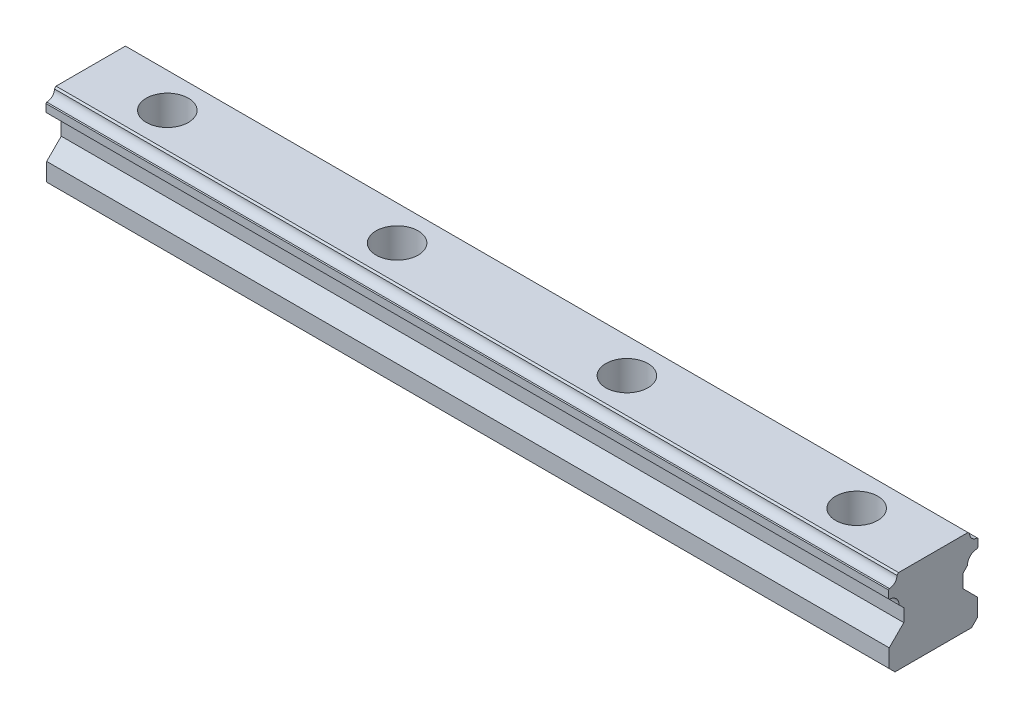
ISO-10303-21;
HEADER;
FILE_DESCRIPTION(('STEP AP214'),'2;1');
FILE_NAME('part.step','',(''),(''),'','','');
FILE_SCHEMA(('AUTOMOTIVE_DESIGN { 1 0 10303 214 1 1 1 1 }'));
ENDSEC;
DATA;
#1=APPLICATION_CONTEXT('core data for automotive mechanical design processes');
#2=APPLICATION_PROTOCOL_DEFINITION('international standard','automotive_design',2000,#1);
#3=PRODUCT_CONTEXT('',#1,'mechanical');
#4=PRODUCT('Part','Part','',(#3));
#5=PRODUCT_RELATED_PRODUCT_CATEGORY('part','',(#4));
#6=PRODUCT_DEFINITION_FORMATION('','',#4);
#7=PRODUCT_DEFINITION_CONTEXT('part definition',#1,'design');
#8=PRODUCT_DEFINITION('design','',#6,#7);
#9=PRODUCT_DEFINITION_SHAPE('','',#8);
#10=(LENGTH_UNIT() NAMED_UNIT(*) SI_UNIT(.MILLI.,.METRE.));
#11=(NAMED_UNIT(*) PLANE_ANGLE_UNIT() SI_UNIT($,.RADIAN.));
#12=(NAMED_UNIT(*) SI_UNIT($,.STERADIAN.) SOLID_ANGLE_UNIT());
#13=UNCERTAINTY_MEASURE_WITH_UNIT(LENGTH_MEASURE(1.E-05),#10,'distance_accuracy_value','');
#14=(GEOMETRIC_REPRESENTATION_CONTEXT(3) GLOBAL_UNCERTAINTY_ASSIGNED_CONTEXT((#13)) GLOBAL_UNIT_ASSIGNED_CONTEXT((#10,
#11,#12)) REPRESENTATION_CONTEXT('',''));
#15=CARTESIAN_POINT('',(0.,0.,0.));
#16=DIRECTION('',(0.,0.,1.));
#17=DIRECTION('',(1.,0.,0.));
#18=AXIS2_PLACEMENT_3D('',#15,#16,#17);
#19=CARTESIAN_POINT('',(220.,21.58,-11.47));
#20=DIRECTION('',(-1.,0.,0.));
#21=DIRECTION('',(0.,0.,1.));
#22=AXIS2_PLACEMENT_3D('',#19,#20,#21);
#23=CYLINDRICAL_SURFACE('',#22,1.99);
#24=CARTESIAN_POINT('',(0.,21.58,-11.47));
#25=DIRECTION('',(-1.,0.,0.));
#26=DIRECTION('',(0.,0.,-1.));
#27=AXIS2_PLACEMENT_3D('',#24,#25,#26);
#28=CIRCLE('',#27,1.99);
#29=CARTESIAN_POINT('',(0.,19.59,-11.47));
#30=VERTEX_POINT('',#29);
#31=CARTESIAN_POINT('',(0.,21.58,-9.47999999999999));
#32=VERTEX_POINT('',#31);
#33=EDGE_CURVE('E225',#30,#32,#28,.T.);
#34=ORIENTED_EDGE('',*,*,#33,.T.);
#35=DIRECTION('',(-1.,0.,0.));
#36=VECTOR('',#35,1.);
#37=CARTESIAN_POINT('',(220.,21.58,-9.47999999999999));
#38=LINE('',#37,#36);
#39=CARTESIAN_POINT('',(220.,21.58,-9.47999999999999));
#40=VERTEX_POINT('',#39);
#41=EDGE_CURVE('E11',#40,#32,#38,.T.);
#42=ORIENTED_EDGE('',*,*,#41,.F.);
#43=CARTESIAN_POINT('',(220.,21.58,-11.47));
#44=DIRECTION('',(-1.,0.,0.));
#45=DIRECTION('',(0.,0.,-1.));
#46=AXIS2_PLACEMENT_3D('',#43,#44,#45);
#47=CIRCLE('',#46,1.99);
#48=CARTESIAN_POINT('',(220.,19.59,-11.47));
#49=VERTEX_POINT('',#48);
#50=EDGE_CURVE('E272',#49,#40,#47,.T.);
#51=ORIENTED_EDGE('',*,*,#50,.F.);
#52=DIRECTION('',(-1.,0.,0.));
#53=VECTOR('',#52,1.);
#54=CARTESIAN_POINT('',(220.,19.59,-11.47));
#55=LINE('',#54,#53);
#56=EDGE_CURVE('E221',#49,#30,#55,.T.);
#57=ORIENTED_EDGE('',*,*,#56,.T.);
#58=EDGE_LOOP('',(#34,#42,#51,#57));
#59=FACE_BOUND('',#58,.T.);
#60=ADVANCED_FACE('F33',(#59),#23,.F.);
#61=CARTESIAN_POINT('',(220.,21.58,-9.47999999999999));
#62=DIRECTION('',(0.,-0.707106781186543,0.707106781186552));
#63=DIRECTION('',(0.,-0.707106781186552,-0.707106781186543));
#64=AXIS2_PLACEMENT_3D('',#61,#62,#63);
#65=PLANE('',#64);
#66=DIRECTION('',(0.,0.707106781186552,0.707106781186543));
#67=VECTOR('',#66,1.);
#68=CARTESIAN_POINT('',(0.,21.58,-9.47999999999999));
#69=LINE('',#68,#67);
#70=CARTESIAN_POINT('',(0.,22.,-9.05999999999999));
#71=VERTEX_POINT('',#70);
#72=EDGE_CURVE('E228',#32,#71,#69,.T.);
#73=ORIENTED_EDGE('',*,*,#72,.T.);
#74=DIRECTION('',(-1.,0.,0.));
#75=VECTOR('',#74,1.);
#76=CARTESIAN_POINT('',(220.,22.,-9.05999999999999));
#77=LINE('',#76,#75);
#78=CARTESIAN_POINT('',(220.,22.,-9.05999999999999));
#79=VERTEX_POINT('',#78);
#80=EDGE_CURVE('E41',#79,#71,#77,.T.);
#81=ORIENTED_EDGE('',*,*,#80,.F.);
#82=DIRECTION('',(0.,0.707106781186552,0.707106781186543));
#83=VECTOR('',#82,1.);
#84=CARTESIAN_POINT('',(220.,21.58,-9.47999999999999));
#85=LINE('',#84,#83);
#86=EDGE_CURVE('E140',#40,#79,#85,.T.);
#87=ORIENTED_EDGE('',*,*,#86,.F.);
#88=ORIENTED_EDGE('',*,*,#41,.T.);
#89=EDGE_LOOP('',(#73,#81,#87,#88));
#90=FACE_BOUND('',#89,.T.);
#91=ADVANCED_FACE('F410',(#90),#65,.F.);
#92=CARTESIAN_POINT('',(220.,22.,-9.05999999999999));
#93=DIRECTION('',(0.,-1.,0.));
#94=DIRECTION('',(0.,0.,-1.));
#95=AXIS2_PLACEMENT_3D('',#92,#93,#94);
#96=PLANE('',#95);
#97=CARTESIAN_POINT('',(200.,22.,0.));
#98=DIRECTION('',(0.,1.,0.));
#99=DIRECTION('',(0.,0.,1.));
#100=AXIS2_PLACEMENT_3D('',#97,#98,#99);
#101=CIRCLE('',#100,5.50000000000001);
#102=CARTESIAN_POINT('',(200.,22.,5.50000000000001));
#103=VERTEX_POINT('',#102);
#104=EDGE_CURVE('E656',#103,#103,#101,.T.);
#105=ORIENTED_EDGE('',*,*,#104,.F.);
#106=EDGE_LOOP('',(#105));
#107=FACE_BOUND('',#106,.T.);
#108=CARTESIAN_POINT('',(140.,22.,0.));
#109=DIRECTION('',(0.,1.,0.));
#110=DIRECTION('',(0.,0.,1.));
#111=AXIS2_PLACEMENT_3D('',#108,#109,#110);
#112=CIRCLE('',#111,5.50000000000001);
#113=CARTESIAN_POINT('',(140.,22.,5.50000000000001));
#114=VERTEX_POINT('',#113);
#115=EDGE_CURVE('E666',#114,#114,#112,.T.);
#116=ORIENTED_EDGE('',*,*,#115,.F.);
#117=EDGE_LOOP('',(#116));
#118=FACE_BOUND('',#117,.T.);
#119=CARTESIAN_POINT('',(80.,22.,0.));
#120=DIRECTION('',(0.,1.,0.));
#121=DIRECTION('',(0.,0.,1.));
#122=AXIS2_PLACEMENT_3D('',#119,#120,#121);
#123=CIRCLE('',#122,5.50000000000001);
#124=CARTESIAN_POINT('',(80.,22.,5.50000000000001));
#125=VERTEX_POINT('',#124);
#126=EDGE_CURVE('E678',#125,#125,#123,.T.);
#127=ORIENTED_EDGE('',*,*,#126,.F.);
#128=EDGE_LOOP('',(#127));
#129=FACE_BOUND('',#128,.T.);
#130=CARTESIAN_POINT('',(20.,22.,0.));
#131=DIRECTION('',(0.,1.,0.));
#132=DIRECTION('',(0.,0.,1.));
#133=AXIS2_PLACEMENT_3D('',#130,#131,#132);
#134=CIRCLE('',#133,5.5);
#135=CARTESIAN_POINT('',(20.,22.,5.5));
#136=VERTEX_POINT('',#135);
#137=EDGE_CURVE('E690',#136,#136,#134,.T.);
#138=ORIENTED_EDGE('',*,*,#137,.F.);
#139=EDGE_LOOP('',(#138));
#140=FACE_BOUND('',#139,.T.);
#141=DIRECTION('',(0.,0.,1.));
#142=VECTOR('',#141,1.);
#143=CARTESIAN_POINT('',(0.,22.,-9.05999999999999));
#144=LINE('',#143,#142);
#145=CARTESIAN_POINT('',(0.,22.,9.05999999999999));
#146=VERTEX_POINT('',#145);
#147=EDGE_CURVE('E231',#71,#146,#144,.T.);
#148=ORIENTED_EDGE('',*,*,#147,.T.);
#149=DIRECTION('',(-1.,0.,0.));
#150=VECTOR('',#149,1.);
#151=CARTESIAN_POINT('',(220.,22.,9.05999999999999));
#152=LINE('',#151,#150);
#153=CARTESIAN_POINT('',(220.,22.,9.05999999999999));
#154=VERTEX_POINT('',#153);
#155=EDGE_CURVE('E327',#154,#146,#152,.T.);
#156=ORIENTED_EDGE('',*,*,#155,.F.);
#157=DIRECTION('',(0.,0.,1.));
#158=VECTOR('',#157,1.);
#159=CARTESIAN_POINT('',(220.,22.,-9.05999999999999));
#160=LINE('',#159,#158);
#161=EDGE_CURVE('E335',#79,#154,#160,.T.);
#162=ORIENTED_EDGE('',*,*,#161,.F.);
#163=ORIENTED_EDGE('',*,*,#80,.T.);
#164=EDGE_LOOP('',(#148,#156,#162,#163));
#165=FACE_BOUND('',#164,.T.);
#166=ADVANCED_FACE('F333',(#107,#118,#129,#140,#165),#96,.F.);
#167=CARTESIAN_POINT('',(220.,21.58,9.47999999999999));
#168=DIRECTION('',(0.,-0.707106781186543,-0.707106781186552));
#169=DIRECTION('',(0.,0.707106781186552,-0.707106781186543));
#170=AXIS2_PLACEMENT_3D('',#167,#168,#169);
#171=PLANE('',#170);
#172=DIRECTION('',(0.,-0.707106781186552,0.707106781186543));
#173=VECTOR('',#172,1.);
#174=CARTESIAN_POINT('',(0.,21.58,9.47999999999999));
#175=LINE('',#174,#173);
#176=CARTESIAN_POINT('',(0.,21.58,9.47999999999999));
#177=VERTEX_POINT('',#176);
#178=EDGE_CURVE('E233',#146,#177,#175,.T.);
#179=ORIENTED_EDGE('',*,*,#178,.T.);
#180=DIRECTION('',(-1.,0.,0.));
#181=VECTOR('',#180,1.);
#182=CARTESIAN_POINT('',(220.,21.58,9.47999999999999));
#183=LINE('',#182,#181);
#184=CARTESIAN_POINT('',(220.,21.58,9.47999999999999));
#185=VERTEX_POINT('',#184);
#186=EDGE_CURVE('E324',#185,#177,#183,.T.);
#187=ORIENTED_EDGE('',*,*,#186,.F.);
#188=DIRECTION('',(0.,-0.707106781186552,0.707106781186543));
#189=VECTOR('',#188,1.);
#190=CARTESIAN_POINT('',(220.,21.58,9.47999999999999));
#191=LINE('',#190,#189);
#192=EDGE_CURVE('E353',#154,#185,#191,.T.);
#193=ORIENTED_EDGE('',*,*,#192,.F.);
#194=ORIENTED_EDGE('',*,*,#155,.T.);
#195=EDGE_LOOP('',(#179,#187,#193,#194));
#196=FACE_BOUND('',#195,.T.);
#197=ADVANCED_FACE('F344',(#196),#171,.F.);
#198=CARTESIAN_POINT('',(220.,21.58,11.47));
#199=DIRECTION('',(-1.,0.,0.));
#200=DIRECTION('',(0.,0.,1.));
#201=AXIS2_PLACEMENT_3D('',#198,#199,#200);
#202=CYLINDRICAL_SURFACE('',#201,1.99);
#203=CARTESIAN_POINT('',(0.,21.58,11.47));
#204=DIRECTION('',(-1.,0.,0.));
#205=DIRECTION('',(0.,0.,1.));
#206=AXIS2_PLACEMENT_3D('',#203,#204,#205);
#207=CIRCLE('',#206,1.99);
#208=CARTESIAN_POINT('',(0.,19.59,11.47));
#209=VERTEX_POINT('',#208);
#210=EDGE_CURVE('E235',#177,#209,#207,.T.);
#211=ORIENTED_EDGE('',*,*,#210,.T.);
#212=DIRECTION('',(-1.,0.,0.));
#213=VECTOR('',#212,1.);
#214=CARTESIAN_POINT('',(220.,19.59,11.47));
#215=LINE('',#214,#213);
#216=CARTESIAN_POINT('',(220.,19.59,11.47));
#217=VERTEX_POINT('',#216);
#218=EDGE_CURVE('E321',#217,#209,#215,.T.);
#219=ORIENTED_EDGE('',*,*,#218,.F.);
#220=CARTESIAN_POINT('',(220.,21.58,11.47));
#221=DIRECTION('',(-1.,0.,0.));
#222=DIRECTION('',(0.,0.,1.));
#223=AXIS2_PLACEMENT_3D('',#220,#221,#222);
#224=CIRCLE('',#223,1.99);
#225=EDGE_CURVE('E350',#185,#217,#224,.T.);
#226=ORIENTED_EDGE('',*,*,#225,.F.);
#227=ORIENTED_EDGE('',*,*,#186,.T.);
#228=EDGE_LOOP('',(#211,#219,#226,#227));
#229=FACE_BOUND('',#228,.T.);
#230=ADVANCED_FACE('F348',(#229),#202,.F.);
#231=CARTESIAN_POINT('',(220.,19.38,11.68));
#232=DIRECTION('',(0.,-0.707106781186542,-0.707106781186553));
#233=DIRECTION('',(0.,0.707106781186553,-0.707106781186542));
#234=AXIS2_PLACEMENT_3D('',#231,#232,#233);
#235=PLANE('',#234);
#236=DIRECTION('',(0.,-0.707106781186553,0.707106781186542));
#237=VECTOR('',#236,1.);
#238=CARTESIAN_POINT('',(0.,19.38,11.68));
#239=LINE('',#238,#237);
#240=CARTESIAN_POINT('',(0.,19.38,11.68));
#241=VERTEX_POINT('',#240);
#242=EDGE_CURVE('E237',#209,#241,#239,.T.);
#243=ORIENTED_EDGE('',*,*,#242,.T.);
#244=DIRECTION('',(-1.,0.,0.));
#245=VECTOR('',#244,1.);
#246=CARTESIAN_POINT('',(220.,19.38,11.68));
#247=LINE('',#246,#245);
#248=CARTESIAN_POINT('',(220.,19.38,11.68));
#249=VERTEX_POINT('',#248);
#250=EDGE_CURVE('E318',#249,#241,#247,.T.);
#251=ORIENTED_EDGE('',*,*,#250,.F.);
#252=DIRECTION('',(0.,-0.707106781186553,0.707106781186542));
#253=VECTOR('',#252,1.);
#254=CARTESIAN_POINT('',(220.,19.38,11.68));
#255=LINE('',#254,#253);
#256=EDGE_CURVE('E352',#217,#249,#255,.T.);
#257=ORIENTED_EDGE('',*,*,#256,.F.);
#258=ORIENTED_EDGE('',*,*,#218,.T.);
#259=EDGE_LOOP('',(#243,#251,#257,#258));
#260=FACE_BOUND('',#259,.T.);
#261=ADVANCED_FACE('F424',(#260),#235,.F.);
#262=CARTESIAN_POINT('',(220.,17.36,11.68));
#263=DIRECTION('',(0.,0.,-1.));
#264=DIRECTION('',(-1.,0.,0.));
#265=AXIS2_PLACEMENT_3D('',#262,#263,#264);
#266=PLANE('',#265);
#267=DIRECTION('',(0.,-1.,0.));
#268=VECTOR('',#267,1.);
#269=CARTESIAN_POINT('',(0.,17.36,11.68));
#270=LINE('',#269,#268);
#271=CARTESIAN_POINT('',(0.,17.36,11.68));
#272=VERTEX_POINT('',#271);
#273=EDGE_CURVE('E239',#241,#272,#270,.T.);
#274=ORIENTED_EDGE('',*,*,#273,.T.);
#275=DIRECTION('',(-1.,0.,0.));
#276=VECTOR('',#275,1.);
#277=CARTESIAN_POINT('',(220.,17.36,11.68));
#278=LINE('',#277,#276);
#279=CARTESIAN_POINT('',(220.,17.36,11.68));
#280=VERTEX_POINT('',#279);
#281=EDGE_CURVE('E315',#280,#272,#278,.T.);
#282=ORIENTED_EDGE('',*,*,#281,.F.);
#283=DIRECTION('',(0.,-1.,0.));
#284=VECTOR('',#283,1.);
#285=CARTESIAN_POINT('',(220.,17.36,11.68));
#286=LINE('',#285,#284);
#287=EDGE_CURVE('E355',#249,#280,#286,.T.);
#288=ORIENTED_EDGE('',*,*,#287,.F.);
#289=ORIENTED_EDGE('',*,*,#250,.T.);
#290=EDGE_LOOP('',(#274,#282,#288,#289));
#291=FACE_BOUND('',#290,.T.);
#292=ADVANCED_FACE('F427',(#291),#266,.F.);
#293=CARTESIAN_POINT('',(220.,17.14,11.46));
#294=DIRECTION('',(0.,0.707106781186548,-0.707106781186548));
#295=DIRECTION('',(0.,0.707106781186548,0.707106781186548));
#296=AXIS2_PLACEMENT_3D('',#293,#294,#295);
#297=PLANE('',#296);
#298=DIRECTION('',(0.,-0.707106781186548,-0.707106781186548));
#299=VECTOR('',#298,1.);
#300=CARTESIAN_POINT('',(0.,17.14,11.46));
#301=LINE('',#300,#299);
#302=CARTESIAN_POINT('',(0.,17.14,11.46));
#303=VERTEX_POINT('',#302);
#304=EDGE_CURVE('E241',#272,#303,#301,.T.);
#305=ORIENTED_EDGE('',*,*,#304,.T.);
#306=DIRECTION('',(-1.,0.,0.));
#307=VECTOR('',#306,1.);
#308=CARTESIAN_POINT('',(220.,17.14,11.46));
#309=LINE('',#308,#307);
#310=CARTESIAN_POINT('',(220.,17.14,11.46));
#311=VERTEX_POINT('',#310);
#312=EDGE_CURVE('E312',#311,#303,#309,.T.);
#313=ORIENTED_EDGE('',*,*,#312,.F.);
#314=DIRECTION('',(0.,-0.707106781186548,-0.707106781186548));
#315=VECTOR('',#314,1.);
#316=CARTESIAN_POINT('',(220.,17.14,11.46));
#317=LINE('',#316,#315);
#318=EDGE_CURVE('E361',#280,#311,#317,.T.);
#319=ORIENTED_EDGE('',*,*,#318,.F.);
#320=ORIENTED_EDGE('',*,*,#281,.T.);
#321=EDGE_LOOP('',(#305,#313,#319,#320));
#322=FACE_BOUND('',#321,.T.);
#323=ADVANCED_FACE('F431',(#322),#297,.F.);
#324=CARTESIAN_POINT('',(220.,14.61,11.46));
#325=DIRECTION('',(-1.,0.,0.));
#326=DIRECTION('',(0.,0.,1.));
#327=AXIS2_PLACEMENT_3D('',#324,#325,#326);
#328=CYLINDRICAL_SURFACE('',#327,2.53);
#329=CARTESIAN_POINT('',(0.,14.61,11.46));
#330=DIRECTION('',(-1.,0.,0.));
#331=DIRECTION('',(0.,0.,1.));
#332=AXIS2_PLACEMENT_3D('',#329,#330,#331);
#333=CIRCLE('',#332,2.53);
#334=CARTESIAN_POINT('',(0.,14.61,8.92999999999999));
#335=VERTEX_POINT('',#334);
#336=EDGE_CURVE('E243',#303,#335,#333,.T.);
#337=ORIENTED_EDGE('',*,*,#336,.T.);
#338=DIRECTION('',(-1.,0.,0.));
#339=VECTOR('',#338,1.);
#340=CARTESIAN_POINT('',(220.,14.61,8.92999999999999));
#341=LINE('',#340,#339);
#342=CARTESIAN_POINT('',(220.,14.61,8.92999999999999));
#343=VERTEX_POINT('',#342);
#344=EDGE_CURVE('E309',#343,#335,#341,.T.);
#345=ORIENTED_EDGE('',*,*,#344,.F.);
#346=CARTESIAN_POINT('',(220.,14.61,11.46));
#347=DIRECTION('',(-1.,0.,0.));
#348=DIRECTION('',(0.,0.,1.));
#349=AXIS2_PLACEMENT_3D('',#346,#347,#348);
#350=CIRCLE('',#349,2.53);
#351=EDGE_CURVE('E363',#311,#343,#350,.T.);
#352=ORIENTED_EDGE('',*,*,#351,.F.);
#353=ORIENTED_EDGE('',*,*,#312,.T.);
#354=EDGE_LOOP('',(#337,#345,#352,#353));
#355=FACE_BOUND('',#354,.T.);
#356=ADVANCED_FACE('F435',(#355),#328,.F.);
#357=CARTESIAN_POINT('',(220.,13.38,7.69999999999999));
#358=DIRECTION('',(0.,0.707106781186549,-0.707106781186547));
#359=DIRECTION('',(0.,0.707106781186547,0.707106781186549));
#360=AXIS2_PLACEMENT_3D('',#357,#358,#359);
#361=PLANE('',#360);
#362=DIRECTION('',(0.,-0.707106781186547,-0.707106781186549));
#363=VECTOR('',#362,1.);
#364=CARTESIAN_POINT('',(0.,13.38,7.69999999999999));
#365=LINE('',#364,#363);
#366=CARTESIAN_POINT('',(0.,13.38,7.69999999999999));
#367=VERTEX_POINT('',#366);
#368=EDGE_CURVE('E245',#335,#367,#365,.T.);
#369=ORIENTED_EDGE('',*,*,#368,.T.);
#370=DIRECTION('',(-1.,0.,0.));
#371=VECTOR('',#370,1.);
#372=CARTESIAN_POINT('',(220.,13.38,7.69999999999999));
#373=LINE('',#372,#371);
#374=CARTESIAN_POINT('',(220.,13.38,7.69999999999999));
#375=VERTEX_POINT('',#374);
#376=EDGE_CURVE('E306',#375,#367,#373,.T.);
#377=ORIENTED_EDGE('',*,*,#376,.F.);
#378=DIRECTION('',(0.,-0.707106781186547,-0.707106781186549));
#379=VECTOR('',#378,1.);
#380=CARTESIAN_POINT('',(220.,13.38,7.69999999999999));
#381=LINE('',#380,#379);
#382=EDGE_CURVE('E365',#343,#375,#381,.T.);
#383=ORIENTED_EDGE('',*,*,#382,.F.);
#384=ORIENTED_EDGE('',*,*,#344,.T.);
#385=EDGE_LOOP('',(#369,#377,#383,#384));
#386=FACE_BOUND('',#385,.T.);
#387=ADVANCED_FACE('F439',(#386),#361,.F.);
#388=CARTESIAN_POINT('',(220.,10.,7.69999999999999));
#389=DIRECTION('',(0.,0.,-1.));
#390=DIRECTION('',(-1.,0.,0.));
#391=AXIS2_PLACEMENT_3D('',#388,#389,#390);
#392=PLANE('',#391);
#393=DIRECTION('',(0.,-1.,0.));
#394=VECTOR('',#393,1.);
#395=CARTESIAN_POINT('',(0.,10.,7.69999999999999));
#396=LINE('',#395,#394);
#397=CARTESIAN_POINT('',(0.,10.,7.69999999999999));
#398=VERTEX_POINT('',#397);
#399=EDGE_CURVE('E247',#367,#398,#396,.T.);
#400=ORIENTED_EDGE('',*,*,#399,.T.);
#401=DIRECTION('',(-1.,0.,0.));
#402=VECTOR('',#401,1.);
#403=CARTESIAN_POINT('',(220.,10.,7.69999999999999));
#404=LINE('',#403,#402);
#405=CARTESIAN_POINT('',(220.,10.,7.69999999999999));
#406=VERTEX_POINT('',#405);
#407=EDGE_CURVE('E303',#406,#398,#404,.T.);
#408=ORIENTED_EDGE('',*,*,#407,.F.);
#409=DIRECTION('',(0.,-1.,0.));
#410=VECTOR('',#409,1.);
#411=CARTESIAN_POINT('',(220.,10.,7.69999999999999));
#412=LINE('',#411,#410);
#413=EDGE_CURVE('E367',#375,#406,#412,.T.);
#414=ORIENTED_EDGE('',*,*,#413,.F.);
#415=ORIENTED_EDGE('',*,*,#376,.T.);
#416=EDGE_LOOP('',(#400,#408,#414,#415));
#417=FACE_BOUND('',#416,.T.);
#418=ADVANCED_FACE('F443',(#417),#392,.F.);
#419=CARTESIAN_POINT('',(220.,6.2,11.5));
#420=DIRECTION('',(0.,-0.707106781186549,-0.707106781186546));
#421=DIRECTION('',(0.,0.707106781186546,-0.707106781186549));
#422=AXIS2_PLACEMENT_3D('',#419,#420,#421);
#423=PLANE('',#422);
#424=DIRECTION('',(0.,-0.707106781186546,0.707106781186549));
#425=VECTOR('',#424,1.);
#426=CARTESIAN_POINT('',(0.,6.2,11.5));
#427=LINE('',#426,#425);
#428=CARTESIAN_POINT('',(0.,6.2,11.5));
#429=VERTEX_POINT('',#428);
#430=EDGE_CURVE('E249',#398,#429,#427,.T.);
#431=ORIENTED_EDGE('',*,*,#430,.T.);
#432=DIRECTION('',(-1.,0.,0.));
#433=VECTOR('',#432,1.);
#434=CARTESIAN_POINT('',(220.,6.2,11.5));
#435=LINE('',#434,#433);
#436=CARTESIAN_POINT('',(220.,6.2,11.5));
#437=VERTEX_POINT('',#436);
#438=EDGE_CURVE('E300',#437,#429,#435,.T.);
#439=ORIENTED_EDGE('',*,*,#438,.F.);
#440=DIRECTION('',(0.,-0.707106781186546,0.707106781186549));
#441=VECTOR('',#440,1.);
#442=CARTESIAN_POINT('',(220.,6.2,11.5));
#443=LINE('',#442,#441);
#444=EDGE_CURVE('E369',#406,#437,#443,.T.);
#445=ORIENTED_EDGE('',*,*,#444,.F.);
#446=ORIENTED_EDGE('',*,*,#407,.T.);
#447=EDGE_LOOP('',(#431,#439,#445,#446));
#448=FACE_BOUND('',#447,.T.);
#449=ADVANCED_FACE('F447',(#448),#423,.F.);
#450=CARTESIAN_POINT('',(220.,1.5,11.5));
#451=DIRECTION('',(0.,0.,-1.));
#452=DIRECTION('',(-1.,0.,0.));
#453=AXIS2_PLACEMENT_3D('',#450,#451,#452);
#454=PLANE('',#453);
#455=DIRECTION('',(0.,-1.,0.));
#456=VECTOR('',#455,1.);
#457=CARTESIAN_POINT('',(0.,1.5,11.5));
#458=LINE('',#457,#456);
#459=CARTESIAN_POINT('',(0.,1.5,11.5));
#460=VERTEX_POINT('',#459);
#461=EDGE_CURVE('E251',#429,#460,#458,.T.);
#462=ORIENTED_EDGE('',*,*,#461,.T.);
#463=DIRECTION('',(-1.,0.,0.));
#464=VECTOR('',#463,1.);
#465=CARTESIAN_POINT('',(220.,1.5,11.5));
#466=LINE('',#465,#464);
#467=CARTESIAN_POINT('',(220.,1.5,11.5));
#468=VERTEX_POINT('',#467);
#469=EDGE_CURVE('E297',#468,#460,#466,.T.);
#470=ORIENTED_EDGE('',*,*,#469,.F.);
#471=DIRECTION('',(0.,-1.,0.));
#472=VECTOR('',#471,1.);
#473=CARTESIAN_POINT('',(220.,1.5,11.5));
#474=LINE('',#473,#472);
#475=EDGE_CURVE('E371',#437,#468,#474,.T.);
#476=ORIENTED_EDGE('',*,*,#475,.F.);
#477=ORIENTED_EDGE('',*,*,#438,.T.);
#478=EDGE_LOOP('',(#462,#470,#476,#477));
#479=FACE_BOUND('',#478,.T.);
#480=ADVANCED_FACE('F451',(#479),#454,.F.);
#481=CARTESIAN_POINT('',(220.,0.,10.));
#482=DIRECTION('',(0.,0.707106781186546,-0.707106781186549));
#483=DIRECTION('',(0.,0.707106781186549,0.707106781186546));
#484=AXIS2_PLACEMENT_3D('',#481,#482,#483);
#485=PLANE('',#484);
#486=DIRECTION('',(0.,-0.707106781186549,-0.707106781186546));
#487=VECTOR('',#486,1.);
#488=CARTESIAN_POINT('',(0.,0.,10.));
#489=LINE('',#488,#487);
#490=CARTESIAN_POINT('',(0.,0.,10.));
#491=VERTEX_POINT('',#490);
#492=EDGE_CURVE('E253',#460,#491,#489,.T.);
#493=ORIENTED_EDGE('',*,*,#492,.T.);
#494=DIRECTION('',(-1.,0.,0.));
#495=VECTOR('',#494,1.);
#496=CARTESIAN_POINT('',(220.,0.,10.));
#497=LINE('',#496,#495);
#498=CARTESIAN_POINT('',(220.,0.,10.));
#499=VERTEX_POINT('',#498);
#500=EDGE_CURVE('E294',#499,#491,#497,.T.);
#501=ORIENTED_EDGE('',*,*,#500,.F.);
#502=DIRECTION('',(0.,-0.707106781186549,-0.707106781186546));
#503=VECTOR('',#502,1.);
#504=CARTESIAN_POINT('',(220.,0.,10.));
#505=LINE('',#504,#503);
#506=EDGE_CURVE('E373',#468,#499,#505,.T.);
#507=ORIENTED_EDGE('',*,*,#506,.F.);
#508=ORIENTED_EDGE('',*,*,#469,.T.);
#509=EDGE_LOOP('',(#493,#501,#507,#508));
#510=FACE_BOUND('',#509,.T.);
#511=ADVANCED_FACE('F455',(#510),#485,.F.);
#512=CARTESIAN_POINT('',(220.,0.,10.));
#513=DIRECTION('',(0.,1.,0.));
#514=DIRECTION('',(0.,0.,1.));
#515=AXIS2_PLACEMENT_3D('',#512,#513,#514);
#516=PLANE('',#515);
#517=CARTESIAN_POINT('',(200.,0.,0.));
#518=DIRECTION('',(0.,1.,0.));
#519=DIRECTION('',(0.,0.,1.));
#520=AXIS2_PLACEMENT_3D('',#517,#518,#519);
#521=CIRCLE('',#520,3.5);
#522=CARTESIAN_POINT('',(200.,0.,3.5));
#523=VERTEX_POINT('',#522);
#524=EDGE_CURVE('E663',#523,#523,#521,.T.);
#525=ORIENTED_EDGE('',*,*,#524,.T.);
#526=EDGE_LOOP('',(#525));
#527=FACE_BOUND('',#526,.T.);
#528=CARTESIAN_POINT('',(140.,0.,0.));
#529=DIRECTION('',(0.,1.,0.));
#530=DIRECTION('',(0.,0.,1.));
#531=AXIS2_PLACEMENT_3D('',#528,#529,#530);
#532=CIRCLE('',#531,3.5);
#533=CARTESIAN_POINT('',(140.,0.,3.5));
#534=VERTEX_POINT('',#533);
#535=EDGE_CURVE('E675',#534,#534,#532,.T.);
#536=ORIENTED_EDGE('',*,*,#535,.T.);
#537=EDGE_LOOP('',(#536));
#538=FACE_BOUND('',#537,.T.);
#539=CARTESIAN_POINT('',(80.,0.,0.));
#540=DIRECTION('',(0.,1.,0.));
#541=DIRECTION('',(0.,0.,1.));
#542=AXIS2_PLACEMENT_3D('',#539,#540,#541);
#543=CIRCLE('',#542,3.49999999999999);
#544=CARTESIAN_POINT('',(80.,0.,3.49999999999999));
#545=VERTEX_POINT('',#544);
#546=EDGE_CURVE('E687',#545,#545,#543,.T.);
#547=ORIENTED_EDGE('',*,*,#546,.T.);
#548=EDGE_LOOP('',(#547));
#549=FACE_BOUND('',#548,.T.);
#550=CARTESIAN_POINT('',(20.,0.,0.));
#551=DIRECTION('',(0.,1.,0.));
#552=DIRECTION('',(0.,0.,1.));
#553=AXIS2_PLACEMENT_3D('',#550,#551,#552);
#554=CIRCLE('',#553,3.5);
#555=CARTESIAN_POINT('',(20.,0.,3.5));
#556=VERTEX_POINT('',#555);
#557=EDGE_CURVE('E229',#556,#556,#554,.T.);
#558=ORIENTED_EDGE('',*,*,#557,.T.);
#559=EDGE_LOOP('',(#558));
#560=FACE_BOUND('',#559,.T.);
#561=DIRECTION('',(0.,0.,-1.));
#562=VECTOR('',#561,1.);
#563=CARTESIAN_POINT('',(0.,0.,10.));
#564=LINE('',#563,#562);
#565=CARTESIAN_POINT('',(0.,0.,-10.));
#566=VERTEX_POINT('',#565);
#567=EDGE_CURVE('E255',#491,#566,#564,.T.);
#568=ORIENTED_EDGE('',*,*,#567,.T.);
#569=DIRECTION('',(-1.,0.,0.));
#570=VECTOR('',#569,1.);
#571=CARTESIAN_POINT('',(220.,0.,-10.));
#572=LINE('',#571,#570);
#573=CARTESIAN_POINT('',(220.,0.,-10.));
#574=VERTEX_POINT('',#573);
#575=EDGE_CURVE('E291',#574,#566,#572,.T.);
#576=ORIENTED_EDGE('',*,*,#575,.F.);
#577=DIRECTION('',(0.,0.,-1.));
#578=VECTOR('',#577,1.);
#579=CARTESIAN_POINT('',(220.,0.,10.));
#580=LINE('',#579,#578);
#581=EDGE_CURVE('E375',#499,#574,#580,.T.);
#582=ORIENTED_EDGE('',*,*,#581,.F.);
#583=ORIENTED_EDGE('',*,*,#500,.T.);
#584=EDGE_LOOP('',(#568,#576,#582,#583));
#585=FACE_BOUND('',#584,.T.);
#586=ADVANCED_FACE('F459',(#527,#538,#549,#560,#585),#516,.F.);
#587=CARTESIAN_POINT('',(220.,0.,-10.));
#588=DIRECTION('',(0.,0.707106781186546,0.707106781186549));
#589=DIRECTION('',(0.,-0.707106781186549,0.707106781186546));
#590=AXIS2_PLACEMENT_3D('',#587,#588,#589);
#591=PLANE('',#590);
#592=DIRECTION('',(0.,0.707106781186549,-0.707106781186546));
#593=VECTOR('',#592,1.);
#594=CARTESIAN_POINT('',(0.,0.,-10.));
#595=LINE('',#594,#593);
#596=CARTESIAN_POINT('',(0.,1.5,-11.5));
#597=VERTEX_POINT('',#596);
#598=EDGE_CURVE('E257',#566,#597,#595,.T.);
#599=ORIENTED_EDGE('',*,*,#598,.T.);
#600=DIRECTION('',(-1.,0.,0.));
#601=VECTOR('',#600,1.);
#602=CARTESIAN_POINT('',(220.,1.5,-11.5));
#603=LINE('',#602,#601);
#604=CARTESIAN_POINT('',(220.,1.5,-11.5));
#605=VERTEX_POINT('',#604);
#606=EDGE_CURVE('E288',#605,#597,#603,.T.);
#607=ORIENTED_EDGE('',*,*,#606,.F.);
#608=DIRECTION('',(0.,0.707106781186549,-0.707106781186546));
#609=VECTOR('',#608,1.);
#610=CARTESIAN_POINT('',(220.,0.,-10.));
#611=LINE('',#610,#609);
#612=EDGE_CURVE('E377',#574,#605,#611,.T.);
#613=ORIENTED_EDGE('',*,*,#612,.F.);
#614=ORIENTED_EDGE('',*,*,#575,.T.);
#615=EDGE_LOOP('',(#599,#607,#613,#614));
#616=FACE_BOUND('',#615,.T.);
#617=ADVANCED_FACE('F463',(#616),#591,.F.);
#618=CARTESIAN_POINT('',(220.,1.5,-11.5));
#619=DIRECTION('',(0.,0.,1.));
#620=DIRECTION('',(1.,0.,0.));
#621=AXIS2_PLACEMENT_3D('',#618,#619,#620);
#622=PLANE('',#621);
#623=DIRECTION('',(0.,1.,0.));
#624=VECTOR('',#623,1.);
#625=CARTESIAN_POINT('',(0.,1.5,-11.5));
#626=LINE('',#625,#624);
#627=CARTESIAN_POINT('',(0.,6.2,-11.5));
#628=VERTEX_POINT('',#627);
#629=EDGE_CURVE('E259',#597,#628,#626,.T.);
#630=ORIENTED_EDGE('',*,*,#629,.T.);
#631=DIRECTION('',(-1.,0.,0.));
#632=VECTOR('',#631,1.);
#633=CARTESIAN_POINT('',(220.,6.2,-11.5));
#634=LINE('',#633,#632);
#635=CARTESIAN_POINT('',(220.,6.2,-11.5));
#636=VERTEX_POINT('',#635);
#637=EDGE_CURVE('E285',#636,#628,#634,.T.);
#638=ORIENTED_EDGE('',*,*,#637,.F.);
#639=DIRECTION('',(0.,1.,0.));
#640=VECTOR('',#639,1.);
#641=CARTESIAN_POINT('',(220.,1.5,-11.5));
#642=LINE('',#641,#640);
#643=EDGE_CURVE('E379',#605,#636,#642,.T.);
#644=ORIENTED_EDGE('',*,*,#643,.F.);
#645=ORIENTED_EDGE('',*,*,#606,.T.);
#646=EDGE_LOOP('',(#630,#638,#644,#645));
#647=FACE_BOUND('',#646,.T.);
#648=ADVANCED_FACE('F467',(#647),#622,.F.);
#649=CARTESIAN_POINT('',(220.,6.2,-11.5));
#650=DIRECTION('',(0.,-0.707106781186549,0.707106781186546));
#651=DIRECTION('',(0.,-0.707106781186546,-0.707106781186549));
#652=AXIS2_PLACEMENT_3D('',#649,#650,#651);
#653=PLANE('',#652);
#654=DIRECTION('',(0.,0.707106781186546,0.707106781186549));
#655=VECTOR('',#654,1.);
#656=CARTESIAN_POINT('',(0.,6.2,-11.5));
#657=LINE('',#656,#655);
#658=CARTESIAN_POINT('',(0.,10.,-7.69999999999999));
#659=VERTEX_POINT('',#658);
#660=EDGE_CURVE('E261',#628,#659,#657,.T.);
#661=ORIENTED_EDGE('',*,*,#660,.T.);
#662=DIRECTION('',(-1.,0.,0.));
#663=VECTOR('',#662,1.);
#664=CARTESIAN_POINT('',(220.,10.,-7.69999999999999));
#665=LINE('',#664,#663);
#666=CARTESIAN_POINT('',(220.,10.,-7.69999999999999));
#667=VERTEX_POINT('',#666);
#668=EDGE_CURVE('E282',#667,#659,#665,.T.);
#669=ORIENTED_EDGE('',*,*,#668,.F.);
#670=DIRECTION('',(0.,0.707106781186546,0.707106781186549));
#671=VECTOR('',#670,1.);
#672=CARTESIAN_POINT('',(220.,6.2,-11.5));
#673=LINE('',#672,#671);
#674=EDGE_CURVE('E381',#636,#667,#673,.T.);
#675=ORIENTED_EDGE('',*,*,#674,.F.);
#676=ORIENTED_EDGE('',*,*,#637,.T.);
#677=EDGE_LOOP('',(#661,#669,#675,#676));
#678=FACE_BOUND('',#677,.T.);
#679=ADVANCED_FACE('F471',(#678),#653,.F.);
#680=CARTESIAN_POINT('',(220.,10.,-7.69999999999999));
#681=DIRECTION('',(0.,0.,1.));
#682=DIRECTION('',(1.,0.,0.));
#683=AXIS2_PLACEMENT_3D('',#680,#681,#682);
#684=PLANE('',#683);
#685=DIRECTION('',(0.,1.,0.));
#686=VECTOR('',#685,1.);
#687=CARTESIAN_POINT('',(0.,10.,-7.69999999999999));
#688=LINE('',#687,#686);
#689=CARTESIAN_POINT('',(0.,13.38,-7.69999999999999));
#690=VERTEX_POINT('',#689);
#691=EDGE_CURVE('E263',#659,#690,#688,.T.);
#692=ORIENTED_EDGE('',*,*,#691,.T.);
#693=DIRECTION('',(-1.,0.,0.));
#694=VECTOR('',#693,1.);
#695=CARTESIAN_POINT('',(220.,13.38,-7.69999999999999));
#696=LINE('',#695,#694);
#697=CARTESIAN_POINT('',(220.,13.38,-7.69999999999999));
#698=VERTEX_POINT('',#697);
#699=EDGE_CURVE('E279',#698,#690,#696,.T.);
#700=ORIENTED_EDGE('',*,*,#699,.F.);
#701=DIRECTION('',(0.,1.,0.));
#702=VECTOR('',#701,1.);
#703=CARTESIAN_POINT('',(220.,10.,-7.69999999999999));
#704=LINE('',#703,#702);
#705=EDGE_CURVE('E383',#667,#698,#704,.T.);
#706=ORIENTED_EDGE('',*,*,#705,.F.);
#707=ORIENTED_EDGE('',*,*,#668,.T.);
#708=EDGE_LOOP('',(#692,#700,#706,#707));
#709=FACE_BOUND('',#708,.T.);
#710=ADVANCED_FACE('F475',(#709),#684,.F.);
#711=CARTESIAN_POINT('',(220.,13.38,-7.69999999999999));
#712=DIRECTION('',(0.,0.707106781186549,0.707106781186547));
#713=DIRECTION('',(0.,-0.707106781186547,0.707106781186549));
#714=AXIS2_PLACEMENT_3D('',#711,#712,#713);
#715=PLANE('',#714);
#716=DIRECTION('',(0.,0.707106781186547,-0.707106781186549));
#717=VECTOR('',#716,1.);
#718=CARTESIAN_POINT('',(0.,13.38,-7.69999999999999));
#719=LINE('',#718,#717);
#720=CARTESIAN_POINT('',(0.,14.61,-8.92999999999999));
#721=VERTEX_POINT('',#720);
#722=EDGE_CURVE('E265',#690,#721,#719,.T.);
#723=ORIENTED_EDGE('',*,*,#722,.T.);
#724=DIRECTION('',(-1.,0.,0.));
#725=VECTOR('',#724,1.);
#726=CARTESIAN_POINT('',(220.,14.61,-8.92999999999999));
#727=LINE('',#726,#725);
#728=CARTESIAN_POINT('',(220.,14.61,-8.92999999999999));
#729=VERTEX_POINT('',#728);
#730=EDGE_CURVE('E276',#729,#721,#727,.T.);
#731=ORIENTED_EDGE('',*,*,#730,.F.);
#732=DIRECTION('',(0.,0.707106781186547,-0.707106781186549));
#733=VECTOR('',#732,1.);
#734=CARTESIAN_POINT('',(220.,13.38,-7.69999999999999));
#735=LINE('',#734,#733);
#736=EDGE_CURVE('E385',#698,#729,#735,.T.);
#737=ORIENTED_EDGE('',*,*,#736,.F.);
#738=ORIENTED_EDGE('',*,*,#699,.T.);
#739=EDGE_LOOP('',(#723,#731,#737,#738));
#740=FACE_BOUND('',#739,.T.);
#741=ADVANCED_FACE('F391',(#740),#715,.F.);
#742=CARTESIAN_POINT('',(220.,14.61,-11.46));
#743=DIRECTION('',(-1.,0.,0.));
#744=DIRECTION('',(0.,0.,1.));
#745=AXIS2_PLACEMENT_3D('',#742,#743,#744);
#746=CYLINDRICAL_SURFACE('',#745,2.53);
#747=CARTESIAN_POINT('',(0.,14.61,-11.46));
#748=DIRECTION('',(-1.,0.,0.));
#749=DIRECTION('',(0.,0.,-1.));
#750=AXIS2_PLACEMENT_3D('',#747,#748,#749);
#751=CIRCLE('',#750,2.53);
#752=CARTESIAN_POINT('',(0.,17.14,-11.46));
#753=VERTEX_POINT('',#752);
#754=EDGE_CURVE('E267',#721,#753,#751,.T.);
#755=ORIENTED_EDGE('',*,*,#754,.T.);
#756=DIRECTION('',(-1.,0.,0.));
#757=VECTOR('',#756,1.);
#758=CARTESIAN_POINT('',(220.,17.14,-11.46));
#759=LINE('',#758,#757);
#760=CARTESIAN_POINT('',(220.,17.14,-11.46));
#761=VERTEX_POINT('',#760);
#762=EDGE_CURVE('E216',#761,#753,#759,.T.);
#763=ORIENTED_EDGE('',*,*,#762,.F.);
#764=CARTESIAN_POINT('',(220.,14.61,-11.46));
#765=DIRECTION('',(-1.,0.,0.));
#766=DIRECTION('',(0.,0.,-1.));
#767=AXIS2_PLACEMENT_3D('',#764,#765,#766);
#768=CIRCLE('',#767,2.53);
#769=EDGE_CURVE('E207',#729,#761,#768,.T.);
#770=ORIENTED_EDGE('',*,*,#769,.F.);
#771=ORIENTED_EDGE('',*,*,#730,.T.);
#772=EDGE_LOOP('',(#755,#763,#770,#771));
#773=FACE_BOUND('',#772,.T.);
#774=ADVANCED_FACE('F395',(#773),#746,.F.);
#775=CARTESIAN_POINT('',(220.,17.14,-11.46));
#776=DIRECTION('',(0.,0.70710678118655,0.707106781186545));
#777=DIRECTION('',(0.,-0.707106781186545,0.70710678118655));
#778=AXIS2_PLACEMENT_3D('',#775,#776,#777);
#779=PLANE('',#778);
#780=DIRECTION('',(0.,0.707106781186545,-0.70710678118655));
#781=VECTOR('',#780,1.);
#782=CARTESIAN_POINT('',(0.,17.14,-11.46));
#783=LINE('',#782,#781);
#784=CARTESIAN_POINT('',(0.,17.36,-11.68));
#785=VERTEX_POINT('',#784);
#786=EDGE_CURVE('E215',#753,#785,#783,.T.);
#787=ORIENTED_EDGE('',*,*,#786,.T.);
#788=DIRECTION('',(-1.,0.,0.));
#789=VECTOR('',#788,1.);
#790=CARTESIAN_POINT('',(220.,17.36,-11.68));
#791=LINE('',#790,#789);
#792=CARTESIAN_POINT('',(220.,17.36,-11.68));
#793=VERTEX_POINT('',#792);
#794=EDGE_CURVE('E212',#793,#785,#791,.T.);
#795=ORIENTED_EDGE('',*,*,#794,.F.);
#796=DIRECTION('',(0.,0.707106781186545,-0.70710678118655));
#797=VECTOR('',#796,1.);
#798=CARTESIAN_POINT('',(220.,17.14,-11.46));
#799=LINE('',#798,#797);
#800=EDGE_CURVE('E201',#761,#793,#799,.T.);
#801=ORIENTED_EDGE('',*,*,#800,.F.);
#802=ORIENTED_EDGE('',*,*,#762,.T.);
#803=EDGE_LOOP('',(#787,#795,#801,#802));
#804=FACE_BOUND('',#803,.T.);
#805=ADVANCED_FACE('F213',(#804),#779,.F.);
#806=CARTESIAN_POINT('',(220.,17.36,-11.68));
#807=DIRECTION('',(0.,0.,1.));
#808=DIRECTION('',(1.,0.,0.));
#809=AXIS2_PLACEMENT_3D('',#806,#807,#808);
#810=PLANE('',#809);
#811=DIRECTION('',(0.,1.,0.));
#812=VECTOR('',#811,1.);
#813=CARTESIAN_POINT('',(0.,17.36,-11.68));
#814=LINE('',#813,#812);
#815=CARTESIAN_POINT('',(0.,19.38,-11.68));
#816=VERTEX_POINT('',#815);
#817=EDGE_CURVE('E126',#785,#816,#814,.T.);
#818=ORIENTED_EDGE('',*,*,#817,.T.);
#819=DIRECTION('',(-1.,0.,0.));
#820=VECTOR('',#819,1.);
#821=CARTESIAN_POINT('',(220.,19.38,-11.68));
#822=LINE('',#821,#820);
#823=CARTESIAN_POINT('',(220.,19.38,-11.68));
#824=VERTEX_POINT('',#823);
#825=EDGE_CURVE('E217',#824,#816,#822,.T.);
#826=ORIENTED_EDGE('',*,*,#825,.F.);
#827=DIRECTION('',(0.,1.,0.));
#828=VECTOR('',#827,1.);
#829=CARTESIAN_POINT('',(220.,17.36,-11.68));
#830=LINE('',#829,#828);
#831=EDGE_CURVE('E205',#793,#824,#830,.T.);
#832=ORIENTED_EDGE('',*,*,#831,.F.);
#833=ORIENTED_EDGE('',*,*,#794,.T.);
#834=EDGE_LOOP('',(#818,#826,#832,#833));
#835=FACE_BOUND('',#834,.T.);
#836=ADVANCED_FACE('F219',(#835),#810,.F.);
#837=CARTESIAN_POINT('',(220.,19.38,-11.68));
#838=DIRECTION('',(0.,-0.70710678118655,0.707106781186545));
#839=DIRECTION('',(0.,-0.707106781186545,-0.70710678118655));
#840=AXIS2_PLACEMENT_3D('',#837,#838,#839);
#841=PLANE('',#840);
#842=DIRECTION('',(0.,0.707106781186545,0.70710678118655));
#843=VECTOR('',#842,1.);
#844=CARTESIAN_POINT('',(0.,19.38,-11.68));
#845=LINE('',#844,#843);
#846=EDGE_CURVE('E132',#816,#30,#845,.T.);
#847=ORIENTED_EDGE('',*,*,#846,.T.);
#848=ORIENTED_EDGE('',*,*,#56,.F.);
#849=DIRECTION('',(0.,0.707106781186545,0.70710678118655));
#850=VECTOR('',#849,1.);
#851=CARTESIAN_POINT('',(220.,19.38,-11.68));
#852=LINE('',#851,#850);
#853=EDGE_CURVE('E49',#824,#49,#852,.T.);
#854=ORIENTED_EDGE('',*,*,#853,.F.);
#855=ORIENTED_EDGE('',*,*,#825,.T.);
#856=EDGE_LOOP('',(#847,#848,#854,#855));
#857=FACE_BOUND('',#856,.T.);
#858=ADVANCED_FACE('F399',(#857),#841,.F.);
#859=CARTESIAN_POINT('',(220.,21.58,-11.47));
#860=DIRECTION('',(1.,0.,0.));
#861=DIRECTION('',(0.,0.,-1.));
#862=AXIS2_PLACEMENT_3D('',#859,#860,#861);
#863=PLANE('',#862);
#864=ORIENTED_EDGE('',*,*,#50,.T.);
#865=ORIENTED_EDGE('',*,*,#86,.T.);
#866=ORIENTED_EDGE('',*,*,#161,.T.);
#867=ORIENTED_EDGE('',*,*,#192,.T.);
#868=ORIENTED_EDGE('',*,*,#225,.T.);
#869=ORIENTED_EDGE('',*,*,#256,.T.);
#870=ORIENTED_EDGE('',*,*,#287,.T.);
#871=ORIENTED_EDGE('',*,*,#318,.T.);
#872=ORIENTED_EDGE('',*,*,#351,.T.);
#873=ORIENTED_EDGE('',*,*,#382,.T.);
#874=ORIENTED_EDGE('',*,*,#413,.T.);
#875=ORIENTED_EDGE('',*,*,#444,.T.);
#876=ORIENTED_EDGE('',*,*,#475,.T.);
#877=ORIENTED_EDGE('',*,*,#506,.T.);
#878=ORIENTED_EDGE('',*,*,#581,.T.);
#879=ORIENTED_EDGE('',*,*,#612,.T.);
#880=ORIENTED_EDGE('',*,*,#643,.T.);
#881=ORIENTED_EDGE('',*,*,#674,.T.);
#882=ORIENTED_EDGE('',*,*,#705,.T.);
#883=ORIENTED_EDGE('',*,*,#736,.T.);
#884=ORIENTED_EDGE('',*,*,#769,.T.);
#885=ORIENTED_EDGE('',*,*,#800,.T.);
#886=ORIENTED_EDGE('',*,*,#831,.T.);
#887=ORIENTED_EDGE('',*,*,#853,.T.);
#888=EDGE_LOOP('',(#864,#865,#866,#867,#868,#869,#870,#871,#872,#873,#874,#875,#876,#877,#878,
#879,#880,#881,#882,#883,#884,#885,#886,#887));
#889=FACE_BOUND('',#888,.T.);
#890=ADVANCED_FACE('F203',(#889),#863,.T.);
#891=CARTESIAN_POINT('',(0.,21.58,-11.47));
#892=DIRECTION('',(1.,0.,0.));
#893=DIRECTION('',(0.,0.,-1.));
#894=AXIS2_PLACEMENT_3D('',#891,#892,#893);
#895=PLANE('',#894);
#896=ORIENTED_EDGE('',*,*,#33,.F.);
#897=ORIENTED_EDGE('',*,*,#846,.F.);
#898=ORIENTED_EDGE('',*,*,#817,.F.);
#899=ORIENTED_EDGE('',*,*,#786,.F.);
#900=ORIENTED_EDGE('',*,*,#754,.F.);
#901=ORIENTED_EDGE('',*,*,#722,.F.);
#902=ORIENTED_EDGE('',*,*,#691,.F.);
#903=ORIENTED_EDGE('',*,*,#660,.F.);
#904=ORIENTED_EDGE('',*,*,#629,.F.);
#905=ORIENTED_EDGE('',*,*,#598,.F.);
#906=ORIENTED_EDGE('',*,*,#567,.F.);
#907=ORIENTED_EDGE('',*,*,#492,.F.);
#908=ORIENTED_EDGE('',*,*,#461,.F.);
#909=ORIENTED_EDGE('',*,*,#430,.F.);
#910=ORIENTED_EDGE('',*,*,#399,.F.);
#911=ORIENTED_EDGE('',*,*,#368,.F.);
#912=ORIENTED_EDGE('',*,*,#336,.F.);
#913=ORIENTED_EDGE('',*,*,#304,.F.);
#914=ORIENTED_EDGE('',*,*,#273,.F.);
#915=ORIENTED_EDGE('',*,*,#242,.F.);
#916=ORIENTED_EDGE('',*,*,#210,.F.);
#917=ORIENTED_EDGE('',*,*,#178,.F.);
#918=ORIENTED_EDGE('',*,*,#147,.F.);
#919=ORIENTED_EDGE('',*,*,#72,.F.);
#920=EDGE_LOOP('',(#896,#897,#898,#899,#900,#901,#902,#903,#904,#905,#906,#907,#908,#909,#910,
#911,#912,#913,#914,#915,#916,#917,#918,#919));
#921=FACE_BOUND('',#920,.T.);
#922=ADVANCED_FACE('F339',(#921),#895,.F.);
#923=CARTESIAN_POINT('',(20.,22.,0.));
#924=DIRECTION('',(0.,1.,0.));
#925=DIRECTION('',(0.,0.,1.));
#926=AXIS2_PLACEMENT_3D('',#923,#924,#925);
#927=CYLINDRICAL_SURFACE('',#926,3.5);
#928=ORIENTED_EDGE('',*,*,#557,.F.);
#929=EDGE_LOOP('',(#928));
#930=FACE_BOUND('',#929,.T.);
#931=CARTESIAN_POINT('',(20.,13.,0.));
#932=DIRECTION('',(0.,1.,0.));
#933=DIRECTION('',(0.,0.,1.));
#934=AXIS2_PLACEMENT_3D('',#931,#932,#933);
#935=CIRCLE('',#934,3.5);
#936=CARTESIAN_POINT('',(20.,13.,3.5));
#937=VERTEX_POINT('',#936);
#938=EDGE_CURVE('E696',#937,#937,#935,.T.);
#939=ORIENTED_EDGE('',*,*,#938,.T.);
#940=EDGE_LOOP('',(#939));
#941=FACE_BOUND('',#940,.T.);
#942=ADVANCED_FACE('F512',(#930,#941),#927,.F.);
#943=CARTESIAN_POINT('',(23.5,13.,0.));
#944=DIRECTION('',(0.,-1.,0.));
#945=DIRECTION('',(0.,0.,-1.));
#946=AXIS2_PLACEMENT_3D('',#943,#944,#945);
#947=PLANE('',#946);
#948=ORIENTED_EDGE('',*,*,#938,.F.);
#949=EDGE_LOOP('',(#948));
#950=FACE_BOUND('',#949,.T.);
#951=CARTESIAN_POINT('',(20.,13.,0.));
#952=DIRECTION('',(0.,1.,0.));
#953=DIRECTION('',(0.,0.,1.));
#954=AXIS2_PLACEMENT_3D('',#951,#952,#953);
#955=CIRCLE('',#954,5.5);
#956=CARTESIAN_POINT('',(20.,13.,5.5));
#957=VERTEX_POINT('',#956);
#958=EDGE_CURVE('E693',#957,#957,#955,.T.);
#959=ORIENTED_EDGE('',*,*,#958,.T.);
#960=EDGE_LOOP('',(#959));
#961=FACE_BOUND('',#960,.T.);
#962=ADVANCED_FACE('F520',(#950,#961),#947,.F.);
#963=CARTESIAN_POINT('',(20.,22.,0.));
#964=DIRECTION('',(0.,1.,0.));
#965=DIRECTION('',(0.,0.,1.));
#966=AXIS2_PLACEMENT_3D('',#963,#964,#965);
#967=CYLINDRICAL_SURFACE('',#966,5.5);
#968=ORIENTED_EDGE('',*,*,#958,.F.);
#969=EDGE_LOOP('',(#968));
#970=FACE_BOUND('',#969,.T.);
#971=ORIENTED_EDGE('',*,*,#137,.T.);
#972=EDGE_LOOP('',(#971));
#973=FACE_BOUND('',#972,.T.);
#974=ADVANCED_FACE('F530',(#970,#973),#967,.F.);
#975=CARTESIAN_POINT('',(80.,22.,0.));
#976=DIRECTION('',(0.,1.,0.));
#977=DIRECTION('',(0.,0.,1.));
#978=AXIS2_PLACEMENT_3D('',#975,#976,#977);
#979=CYLINDRICAL_SURFACE('',#978,3.5);
#980=ORIENTED_EDGE('',*,*,#546,.F.);
#981=EDGE_LOOP('',(#980));
#982=FACE_BOUND('',#981,.T.);
#983=CARTESIAN_POINT('',(80.,13.,0.));
#984=DIRECTION('',(0.,1.,0.));
#985=DIRECTION('',(0.,0.,1.));
#986=AXIS2_PLACEMENT_3D('',#983,#984,#985);
#987=CIRCLE('',#986,3.5);
#988=CARTESIAN_POINT('',(80.,13.,3.5));
#989=VERTEX_POINT('',#988);
#990=EDGE_CURVE('E684',#989,#989,#987,.T.);
#991=ORIENTED_EDGE('',*,*,#990,.T.);
#992=EDGE_LOOP('',(#991));
#993=FACE_BOUND('',#992,.T.);
#994=ADVANCED_FACE('F540',(#982,#993),#979,.F.);
#995=CARTESIAN_POINT('',(83.5,13.,0.));
#996=DIRECTION('',(0.,-1.,0.));
#997=DIRECTION('',(0.,0.,-1.));
#998=AXIS2_PLACEMENT_3D('',#995,#996,#997);
#999=PLANE('',#998);
#1000=ORIENTED_EDGE('',*,*,#990,.F.);
#1001=EDGE_LOOP('',(#1000));
#1002=FACE_BOUND('',#1001,.T.);
#1003=CARTESIAN_POINT('',(80.,13.,0.));
#1004=DIRECTION('',(0.,1.,0.));
#1005=DIRECTION('',(0.,0.,1.));
#1006=AXIS2_PLACEMENT_3D('',#1003,#1004,#1005);
#1007=CIRCLE('',#1006,5.49999999999999);
#1008=CARTESIAN_POINT('',(80.,13.,5.49999999999999));
#1009=VERTEX_POINT('',#1008);
#1010=EDGE_CURVE('E681',#1009,#1009,#1007,.T.);
#1011=ORIENTED_EDGE('',*,*,#1010,.T.);
#1012=EDGE_LOOP('',(#1011));
#1013=FACE_BOUND('',#1012,.T.);
#1014=ADVANCED_FACE('F566',(#1002,#1013),#999,.F.);
#1015=CARTESIAN_POINT('',(80.,22.,0.));
#1016=DIRECTION('',(0.,1.,0.));
#1017=DIRECTION('',(0.,0.,1.));
#1018=AXIS2_PLACEMENT_3D('',#1015,#1016,#1017);
#1019=CYLINDRICAL_SURFACE('',#1018,5.5);
#1020=ORIENTED_EDGE('',*,*,#1010,.F.);
#1021=EDGE_LOOP('',(#1020));
#1022=FACE_BOUND('',#1021,.T.);
#1023=ORIENTED_EDGE('',*,*,#126,.T.);
#1024=EDGE_LOOP('',(#1023));
#1025=FACE_BOUND('',#1024,.T.);
#1026=ADVANCED_FACE('F576',(#1022,#1025),#1019,.F.);
#1027=CARTESIAN_POINT('',(140.,22.,0.));
#1028=DIRECTION('',(0.,1.,0.));
#1029=DIRECTION('',(0.,0.,1.));
#1030=AXIS2_PLACEMENT_3D('',#1027,#1028,#1029);
#1031=CYLINDRICAL_SURFACE('',#1030,3.5);
#1032=ORIENTED_EDGE('',*,*,#535,.F.);
#1033=EDGE_LOOP('',(#1032));
#1034=FACE_BOUND('',#1033,.T.);
#1035=CARTESIAN_POINT('',(140.,13.,0.));
#1036=DIRECTION('',(0.,1.,0.));
#1037=DIRECTION('',(0.,0.,1.));
#1038=AXIS2_PLACEMENT_3D('',#1035,#1036,#1037);
#1039=CIRCLE('',#1038,3.5);
#1040=CARTESIAN_POINT('',(140.,13.,3.5));
#1041=VERTEX_POINT('',#1040);
#1042=EDGE_CURVE('E672',#1041,#1041,#1039,.T.);
#1043=ORIENTED_EDGE('',*,*,#1042,.T.);
#1044=EDGE_LOOP('',(#1043));
#1045=FACE_BOUND('',#1044,.T.);
#1046=ADVANCED_FACE('F586',(#1034,#1045),#1031,.F.);
#1047=CARTESIAN_POINT('',(143.5,13.,0.));
#1048=DIRECTION('',(0.,-1.,0.));
#1049=DIRECTION('',(0.,0.,-1.));
#1050=AXIS2_PLACEMENT_3D('',#1047,#1048,#1049);
#1051=PLANE('',#1050);
#1052=ORIENTED_EDGE('',*,*,#1042,.F.);
#1053=EDGE_LOOP('',(#1052));
#1054=FACE_BOUND('',#1053,.T.);
#1055=CARTESIAN_POINT('',(140.,13.,0.));
#1056=DIRECTION('',(0.,1.,0.));
#1057=DIRECTION('',(0.,0.,1.));
#1058=AXIS2_PLACEMENT_3D('',#1055,#1056,#1057);
#1059=CIRCLE('',#1058,5.50000000000001);
#1060=CARTESIAN_POINT('',(140.,13.,5.50000000000001));
#1061=VERTEX_POINT('',#1060);
#1062=EDGE_CURVE('E669',#1061,#1061,#1059,.T.);
#1063=ORIENTED_EDGE('',*,*,#1062,.T.);
#1064=EDGE_LOOP('',(#1063));
#1065=FACE_BOUND('',#1064,.T.);
#1066=ADVANCED_FACE('F596',(#1054,#1065),#1051,.F.);
#1067=CARTESIAN_POINT('',(140.,22.,0.));
#1068=DIRECTION('',(0.,1.,0.));
#1069=DIRECTION('',(0.,0.,1.));
#1070=AXIS2_PLACEMENT_3D('',#1067,#1068,#1069);
#1071=CYLINDRICAL_SURFACE('',#1070,5.50000000000001);
#1072=ORIENTED_EDGE('',*,*,#1062,.F.);
#1073=EDGE_LOOP('',(#1072));
#1074=FACE_BOUND('',#1073,.T.);
#1075=ORIENTED_EDGE('',*,*,#115,.T.);
#1076=EDGE_LOOP('',(#1075));
#1077=FACE_BOUND('',#1076,.T.);
#1078=ADVANCED_FACE('F606',(#1074,#1077),#1071,.F.);
#1079=CARTESIAN_POINT('',(200.,22.,0.));
#1080=DIRECTION('',(0.,1.,0.));
#1081=DIRECTION('',(0.,0.,1.));
#1082=AXIS2_PLACEMENT_3D('',#1079,#1080,#1081);
#1083=CYLINDRICAL_SURFACE('',#1082,3.5);
#1084=ORIENTED_EDGE('',*,*,#524,.F.);
#1085=EDGE_LOOP('',(#1084));
#1086=FACE_BOUND('',#1085,.T.);
#1087=CARTESIAN_POINT('',(200.,13.,0.));
#1088=DIRECTION('',(0.,1.,0.));
#1089=DIRECTION('',(0.,0.,1.));
#1090=AXIS2_PLACEMENT_3D('',#1087,#1088,#1089);
#1091=CIRCLE('',#1090,3.5);
#1092=CARTESIAN_POINT('',(200.,13.,3.5));
#1093=VERTEX_POINT('',#1092);
#1094=EDGE_CURVE('E658',#1093,#1093,#1091,.T.);
#1095=ORIENTED_EDGE('',*,*,#1094,.T.);
#1096=EDGE_LOOP('',(#1095));
#1097=FACE_BOUND('',#1096,.T.);
#1098=ADVANCED_FACE('F616',(#1086,#1097),#1083,.F.);
#1099=CARTESIAN_POINT('',(203.5,13.,0.));
#1100=DIRECTION('',(0.,-1.,0.));
#1101=DIRECTION('',(0.,0.,-1.));
#1102=AXIS2_PLACEMENT_3D('',#1099,#1100,#1101);
#1103=PLANE('',#1102);
#1104=ORIENTED_EDGE('',*,*,#1094,.F.);
#1105=EDGE_LOOP('',(#1104));
#1106=FACE_BOUND('',#1105,.T.);
#1107=CARTESIAN_POINT('',(200.,13.,0.));
#1108=DIRECTION('',(0.,1.,0.));
#1109=DIRECTION('',(0.,0.,1.));
#1110=AXIS2_PLACEMENT_3D('',#1107,#1108,#1109);
#1111=CIRCLE('',#1110,5.50000000000001);
#1112=CARTESIAN_POINT('',(200.,13.,5.50000000000001));
#1113=VERTEX_POINT('',#1112);
#1114=EDGE_CURVE('E653',#1113,#1113,#1111,.T.);
#1115=ORIENTED_EDGE('',*,*,#1114,.T.);
#1116=EDGE_LOOP('',(#1115));
#1117=FACE_BOUND('',#1116,.T.);
#1118=ADVANCED_FACE('F626',(#1106,#1117),#1103,.F.);
#1119=CARTESIAN_POINT('',(200.,22.,0.));
#1120=DIRECTION('',(0.,1.,0.));
#1121=DIRECTION('',(0.,0.,1.));
#1122=AXIS2_PLACEMENT_3D('',#1119,#1120,#1121);
#1123=CYLINDRICAL_SURFACE('',#1122,5.50000000000001);
#1124=ORIENTED_EDGE('',*,*,#1114,.F.);
#1125=EDGE_LOOP('',(#1124));
#1126=FACE_BOUND('',#1125,.T.);
#1127=ORIENTED_EDGE('',*,*,#104,.T.);
#1128=EDGE_LOOP('',(#1127));
#1129=FACE_BOUND('',#1128,.T.);
#1130=ADVANCED_FACE('F636',(#1126,#1129),#1123,.F.);
#1131=CLOSED_SHELL('',(#60,#91,#166,#197,#230,#261,#292,#323,#356,#387,#418,#449,#480,#511,#586,
#617,#648,#679,#710,#741,#774,#805,#836,#858,#890,#922,#942,#962,#974,#994,#1014,#1026,#1046,
#1066,#1078,#1098,#1118,#1130));
#1132=MANIFOLD_SOLID_BREP('B2',#1131);
#1133=ADVANCED_BREP_SHAPE_REPRESENTATION('',(#18,#1132),#14);
#1134=SHAPE_DEFINITION_REPRESENTATION(#9,#1133);
ENDSEC;
END-ISO-10303-21;
